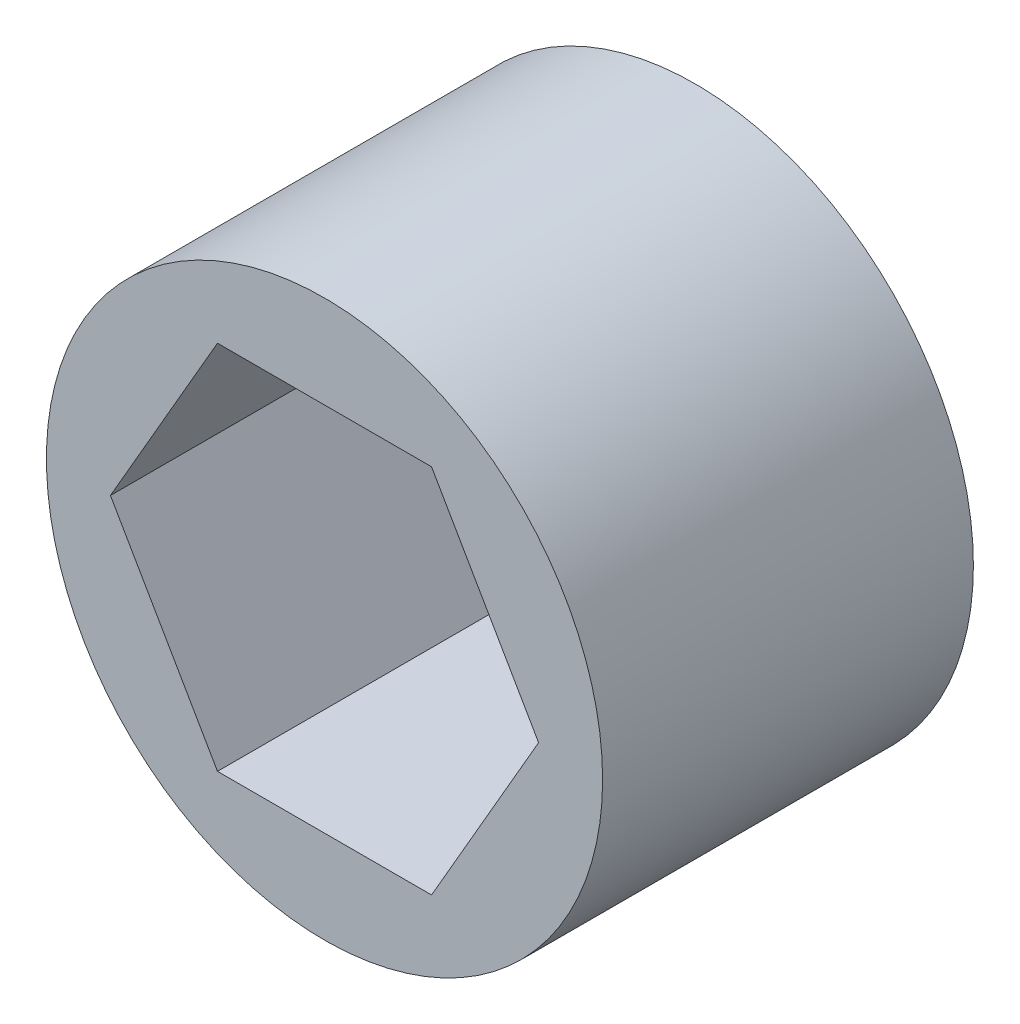
ISO-10303-21;
HEADER;
FILE_DESCRIPTION(('STEP AP214'),'2;1');
FILE_NAME('part.step','',(''),(''),'','','');
FILE_SCHEMA(('AUTOMOTIVE_DESIGN { 1 0 10303 214 1 1 1 1 }'));
ENDSEC;
DATA;
#1=APPLICATION_CONTEXT('core data for automotive mechanical design processes');
#2=APPLICATION_PROTOCOL_DEFINITION('international standard','automotive_design',2000,#1);
#3=PRODUCT_CONTEXT('',#1,'mechanical');
#4=PRODUCT('Part','Part','',(#3));
#5=PRODUCT_RELATED_PRODUCT_CATEGORY('part','',(#4));
#6=PRODUCT_DEFINITION_FORMATION('','',#4);
#7=PRODUCT_DEFINITION_CONTEXT('part definition',#1,'design');
#8=PRODUCT_DEFINITION('design','',#6,#7);
#9=PRODUCT_DEFINITION_SHAPE('','',#8);
#10=(LENGTH_UNIT() NAMED_UNIT(*) SI_UNIT(.MILLI.,.METRE.));
#11=(NAMED_UNIT(*) PLANE_ANGLE_UNIT() SI_UNIT($,.RADIAN.));
#12=(NAMED_UNIT(*) SI_UNIT($,.STERADIAN.) SOLID_ANGLE_UNIT());
#13=UNCERTAINTY_MEASURE_WITH_UNIT(LENGTH_MEASURE(1.E-05),#10,'distance_accuracy_value','');
#14=(GEOMETRIC_REPRESENTATION_CONTEXT(3) GLOBAL_UNCERTAINTY_ASSIGNED_CONTEXT((#13)) GLOBAL_UNIT_ASSIGNED_CONTEXT((#10,
#11,#12)) REPRESENTATION_CONTEXT('',''));
#15=CARTESIAN_POINT('',(0.,0.,0.));
#16=DIRECTION('',(0.,0.,1.));
#17=DIRECTION('',(1.,0.,0.));
#18=AXIS2_PLACEMENT_3D('',#15,#16,#17);
#19=CARTESIAN_POINT('',(0.,0.,12.7));
#20=DIRECTION('',(0.,0.,1.));
#21=DIRECTION('',(1.,0.,0.));
#22=AXIS2_PLACEMENT_3D('',#19,#20,#21);
#23=PLANE('',#22);
#24=CARTESIAN_POINT('',(0.,0.,12.7));
#25=DIRECTION('',(0.,0.,1.));
#26=DIRECTION('',(1.,0.,0.));
#27=AXIS2_PLACEMENT_3D('',#24,#25,#26);
#28=CIRCLE('',#27,9.525);
#29=CARTESIAN_POINT('',(9.525,0.,12.7));
#30=VERTEX_POINT('',#29);
#31=EDGE_CURVE('E11',#30,#30,#28,.T.);
#32=ORIENTED_EDGE('',*,*,#31,.T.);
#33=EDGE_LOOP('',(#32));
#34=FACE_BOUND('',#33,.T.);
#35=DIRECTION('',(-1.,0.,0.));
#36=VECTOR('',#35,1.);
#37=CARTESIAN_POINT('',(3.66617420935412,6.35,12.7));
#38=LINE('',#37,#36);
#39=CARTESIAN_POINT('',(3.66617420935412,6.35,12.7));
#40=VERTEX_POINT('',#39);
#41=CARTESIAN_POINT('',(-3.66617420935412,6.35,12.7));
#42=VERTEX_POINT('',#41);
#43=EDGE_CURVE('E98',#40,#42,#38,.T.);
#44=ORIENTED_EDGE('',*,*,#43,.F.);
#45=DIRECTION('',(-0.5,0.866025403784439,0.));
#46=VECTOR('',#45,1.);
#47=CARTESIAN_POINT('',(7.33234841870825,0.,12.7));
#48=LINE('',#47,#46);
#49=CARTESIAN_POINT('',(7.33234841870825,0.,12.7));
#50=VERTEX_POINT('',#49);
#51=EDGE_CURVE('E90',#50,#40,#48,.T.);
#52=ORIENTED_EDGE('',*,*,#51,.F.);
#53=DIRECTION('',(0.5,0.866025403784439,0.));
#54=VECTOR('',#53,1.);
#55=CARTESIAN_POINT('',(3.66617420935412,-6.35,12.7));
#56=LINE('',#55,#54);
#57=CARTESIAN_POINT('',(3.66617420935412,-6.35,12.7));
#58=VERTEX_POINT('',#57);
#59=EDGE_CURVE('E118',#58,#50,#56,.T.);
#60=ORIENTED_EDGE('',*,*,#59,.F.);
#61=DIRECTION('',(1.,0.,0.));
#62=VECTOR('',#61,1.);
#63=CARTESIAN_POINT('',(-3.66617420935412,-6.35,12.7));
#64=LINE('',#63,#62);
#65=CARTESIAN_POINT('',(-3.66617420935412,-6.35,12.7));
#66=VERTEX_POINT('',#65);
#67=EDGE_CURVE('E116',#66,#58,#64,.T.);
#68=ORIENTED_EDGE('',*,*,#67,.F.);
#69=DIRECTION('',(0.5,-0.866025403784439,0.));
#70=VECTOR('',#69,1.);
#71=CARTESIAN_POINT('',(-7.33234841870824,0.,12.7));
#72=LINE('',#71,#70);
#73=CARTESIAN_POINT('',(-7.33234841870824,0.,12.7));
#74=VERTEX_POINT('',#73);
#75=EDGE_CURVE('E112',#74,#66,#72,.T.);
#76=ORIENTED_EDGE('',*,*,#75,.F.);
#77=DIRECTION('',(-0.5,-0.866025403784439,0.));
#78=VECTOR('',#77,1.);
#79=CARTESIAN_POINT('',(-3.66617420935412,6.35,12.7));
#80=LINE('',#79,#78);
#81=EDGE_CURVE('E110',#42,#74,#80,.T.);
#82=ORIENTED_EDGE('',*,*,#81,.F.);
#83=EDGE_LOOP('',(#44,#52,#60,#68,#76,#82));
#84=FACE_BOUND('',#83,.T.);
#85=ADVANCED_FACE('F37',(#34,#84),#23,.T.);
#86=CARTESIAN_POINT('',(0.,0.,0.));
#87=DIRECTION('',(0.,0.,1.));
#88=DIRECTION('',(1.,0.,0.));
#89=AXIS2_PLACEMENT_3D('',#86,#87,#88);
#90=PLANE('',#89);
#91=CARTESIAN_POINT('',(0.,0.,0.));
#92=DIRECTION('',(0.,0.,1.));
#93=DIRECTION('',(1.,0.,0.));
#94=AXIS2_PLACEMENT_3D('',#91,#92,#93);
#95=CIRCLE('',#94,9.525);
#96=CARTESIAN_POINT('',(9.525,0.,0.));
#97=VERTEX_POINT('',#96);
#98=EDGE_CURVE('E41',#97,#97,#95,.T.);
#99=ORIENTED_EDGE('',*,*,#98,.F.);
#100=EDGE_LOOP('',(#99));
#101=FACE_BOUND('',#100,.T.);
#102=DIRECTION('',(-0.5,0.866025403784439,0.));
#103=VECTOR('',#102,1.);
#104=CARTESIAN_POINT('',(7.33234841870825,0.,0.));
#105=LINE('',#104,#103);
#106=CARTESIAN_POINT('',(7.33234841870825,0.,0.));
#107=VERTEX_POINT('',#106);
#108=CARTESIAN_POINT('',(3.66617420935412,6.35,0.));
#109=VERTEX_POINT('',#108);
#110=EDGE_CURVE('E60',#107,#109,#105,.T.);
#111=ORIENTED_EDGE('',*,*,#110,.T.);
#112=DIRECTION('',(-1.,0.,0.));
#113=VECTOR('',#112,1.);
#114=CARTESIAN_POINT('',(3.66617420935412,6.35,0.));
#115=LINE('',#114,#113);
#116=CARTESIAN_POINT('',(-3.66617420935412,6.35,0.));
#117=VERTEX_POINT('',#116);
#118=EDGE_CURVE('E105',#109,#117,#115,.T.);
#119=ORIENTED_EDGE('',*,*,#118,.T.);
#120=DIRECTION('',(-0.5,-0.866025403784439,0.));
#121=VECTOR('',#120,1.);
#122=CARTESIAN_POINT('',(-3.66617420935412,6.35,0.));
#123=LINE('',#122,#121);
#124=CARTESIAN_POINT('',(-7.33234841870824,0.,0.));
#125=VERTEX_POINT('',#124);
#126=EDGE_CURVE('E122',#117,#125,#123,.T.);
#127=ORIENTED_EDGE('',*,*,#126,.T.);
#128=DIRECTION('',(0.5,-0.866025403784439,0.));
#129=VECTOR('',#128,1.);
#130=CARTESIAN_POINT('',(-7.33234841870824,0.,0.));
#131=LINE('',#130,#129);
#132=CARTESIAN_POINT('',(-3.66617420935412,-6.35,0.));
#133=VERTEX_POINT('',#132);
#134=EDGE_CURVE('E125',#125,#133,#131,.T.);
#135=ORIENTED_EDGE('',*,*,#134,.T.);
#136=DIRECTION('',(1.,0.,0.));
#137=VECTOR('',#136,1.);
#138=CARTESIAN_POINT('',(-3.66617420935412,-6.35,0.));
#139=LINE('',#138,#137);
#140=CARTESIAN_POINT('',(3.66617420935412,-6.35,0.));
#141=VERTEX_POINT('',#140);
#142=EDGE_CURVE('E128',#133,#141,#139,.T.);
#143=ORIENTED_EDGE('',*,*,#142,.T.);
#144=DIRECTION('',(0.5,0.866025403784439,0.));
#145=VECTOR('',#144,1.);
#146=CARTESIAN_POINT('',(3.66617420935412,-6.35,0.));
#147=LINE('',#146,#145);
#148=EDGE_CURVE('E99',#141,#107,#147,.T.);
#149=ORIENTED_EDGE('',*,*,#148,.T.);
#150=EDGE_LOOP('',(#111,#119,#127,#135,#143,#149));
#151=FACE_BOUND('',#150,.T.);
#152=ADVANCED_FACE('F145',(#101,#151),#90,.F.);
#153=CARTESIAN_POINT('',(0.,0.,12.7));
#154=DIRECTION('',(0.,0.,-1.));
#155=DIRECTION('',(-1.,0.,0.));
#156=AXIS2_PLACEMENT_3D('',#153,#154,#155);
#157=CYLINDRICAL_SURFACE('',#156,9.525);
#158=ORIENTED_EDGE('',*,*,#31,.F.);
#159=EDGE_LOOP('',(#158));
#160=FACE_BOUND('',#159,.T.);
#161=ORIENTED_EDGE('',*,*,#98,.T.);
#162=EDGE_LOOP('',(#161));
#163=FACE_BOUND('',#162,.T.);
#164=ADVANCED_FACE('F39',(#160,#163),#157,.T.);
#165=CARTESIAN_POINT('',(7.33234841870825,0.,12.7));
#166=DIRECTION('',(-0.866025403784439,-0.5,0.));
#167=DIRECTION('',(0.5,-0.866025403784439,0.));
#168=AXIS2_PLACEMENT_3D('',#165,#166,#167);
#169=PLANE('',#168);
#170=ORIENTED_EDGE('',*,*,#110,.F.);
#171=DIRECTION('',(0.,0.,-1.));
#172=VECTOR('',#171,1.);
#173=CARTESIAN_POINT('',(7.33234841870825,0.,12.7));
#174=LINE('',#173,#172);
#175=EDGE_CURVE('E94',#50,#107,#174,.T.);
#176=ORIENTED_EDGE('',*,*,#175,.F.);
#177=ORIENTED_EDGE('',*,*,#51,.T.);
#178=DIRECTION('',(0.,0.,-1.));
#179=VECTOR('',#178,1.);
#180=CARTESIAN_POINT('',(3.66617420935412,6.35,12.7));
#181=LINE('',#180,#179);
#182=EDGE_CURVE('E93',#40,#109,#181,.T.);
#183=ORIENTED_EDGE('',*,*,#182,.T.);
#184=EDGE_LOOP('',(#170,#176,#177,#183));
#185=FACE_BOUND('',#184,.T.);
#186=ADVANCED_FACE('F92',(#185),#169,.T.);
#187=CARTESIAN_POINT('',(3.66617420935412,6.35,12.7));
#188=DIRECTION('',(0.,-1.,0.));
#189=DIRECTION('',(1.,0.,0.));
#190=AXIS2_PLACEMENT_3D('',#187,#188,#189);
#191=PLANE('',#190);
#192=ORIENTED_EDGE('',*,*,#118,.F.);
#193=ORIENTED_EDGE('',*,*,#182,.F.);
#194=ORIENTED_EDGE('',*,*,#43,.T.);
#195=DIRECTION('',(0.,0.,-1.));
#196=VECTOR('',#195,1.);
#197=CARTESIAN_POINT('',(-3.66617420935412,6.35,12.7));
#198=LINE('',#197,#196);
#199=EDGE_CURVE('E106',#42,#117,#198,.T.);
#200=ORIENTED_EDGE('',*,*,#199,.T.);
#201=EDGE_LOOP('',(#192,#193,#194,#200));
#202=FACE_BOUND('',#201,.T.);
#203=ADVANCED_FACE('F102',(#202),#191,.T.);
#204=CARTESIAN_POINT('',(-3.66617420935412,6.35,12.7));
#205=DIRECTION('',(0.866025403784439,-0.5,0.));
#206=DIRECTION('',(0.5,0.866025403784439,0.));
#207=AXIS2_PLACEMENT_3D('',#204,#205,#206);
#208=PLANE('',#207);
#209=ORIENTED_EDGE('',*,*,#126,.F.);
#210=ORIENTED_EDGE('',*,*,#199,.F.);
#211=ORIENTED_EDGE('',*,*,#81,.T.);
#212=DIRECTION('',(0.,0.,-1.));
#213=VECTOR('',#212,1.);
#214=CARTESIAN_POINT('',(-7.33234841870824,0.,12.7));
#215=LINE('',#214,#213);
#216=EDGE_CURVE('E137',#74,#125,#215,.T.);
#217=ORIENTED_EDGE('',*,*,#216,.T.);
#218=EDGE_LOOP('',(#209,#210,#211,#217));
#219=FACE_BOUND('',#218,.T.);
#220=ADVANCED_FACE('F141',(#219),#208,.T.);
#221=CARTESIAN_POINT('',(-7.33234841870824,0.,12.7));
#222=DIRECTION('',(0.866025403784439,0.5,0.));
#223=DIRECTION('',(-0.5,0.866025403784439,0.));
#224=AXIS2_PLACEMENT_3D('',#221,#222,#223);
#225=PLANE('',#224);
#226=ORIENTED_EDGE('',*,*,#134,.F.);
#227=ORIENTED_EDGE('',*,*,#216,.F.);
#228=ORIENTED_EDGE('',*,*,#75,.T.);
#229=DIRECTION('',(0.,0.,-1.));
#230=VECTOR('',#229,1.);
#231=CARTESIAN_POINT('',(-3.66617420935412,-6.35,12.7));
#232=LINE('',#231,#230);
#233=EDGE_CURVE('E135',#66,#133,#232,.T.);
#234=ORIENTED_EDGE('',*,*,#233,.T.);
#235=EDGE_LOOP('',(#226,#227,#228,#234));
#236=FACE_BOUND('',#235,.T.);
#237=ADVANCED_FACE('F153',(#236),#225,.T.);
#238=CARTESIAN_POINT('',(-3.66617420935412,-6.35,12.7));
#239=DIRECTION('',(0.,1.,0.));
#240=DIRECTION('',(0.,0.,1.));
#241=AXIS2_PLACEMENT_3D('',#238,#239,#240);
#242=PLANE('',#241);
#243=ORIENTED_EDGE('',*,*,#142,.F.);
#244=ORIENTED_EDGE('',*,*,#233,.F.);
#245=ORIENTED_EDGE('',*,*,#67,.T.);
#246=DIRECTION('',(0.,0.,-1.));
#247=VECTOR('',#246,1.);
#248=CARTESIAN_POINT('',(3.66617420935412,-6.35,12.7));
#249=LINE('',#248,#247);
#250=EDGE_CURVE('E52',#58,#141,#249,.T.);
#251=ORIENTED_EDGE('',*,*,#250,.T.);
#252=EDGE_LOOP('',(#243,#244,#245,#251));
#253=FACE_BOUND('',#252,.T.);
#254=ADVANCED_FACE('F151',(#253),#242,.T.);
#255=CARTESIAN_POINT('',(3.66617420935412,-6.35,12.7));
#256=DIRECTION('',(-0.866025403784439,0.5,0.));
#257=DIRECTION('',(-0.5,-0.866025403784439,0.));
#258=AXIS2_PLACEMENT_3D('',#255,#256,#257);
#259=PLANE('',#258);
#260=ORIENTED_EDGE('',*,*,#148,.F.);
#261=ORIENTED_EDGE('',*,*,#250,.F.);
#262=ORIENTED_EDGE('',*,*,#59,.T.);
#263=ORIENTED_EDGE('',*,*,#175,.T.);
#264=EDGE_LOOP('',(#260,#261,#262,#263));
#265=FACE_BOUND('',#264,.T.);
#266=ADVANCED_FACE('F147',(#265),#259,.T.);
#267=CLOSED_SHELL('',(#85,#152,#164,#186,#203,#220,#237,#254,#266));
#268=MANIFOLD_SOLID_BREP('B2',#267);
#269=ADVANCED_BREP_SHAPE_REPRESENTATION('',(#18,#268),#14);
#270=SHAPE_DEFINITION_REPRESENTATION(#9,#269);
ENDSEC;
END-ISO-10303-21;
